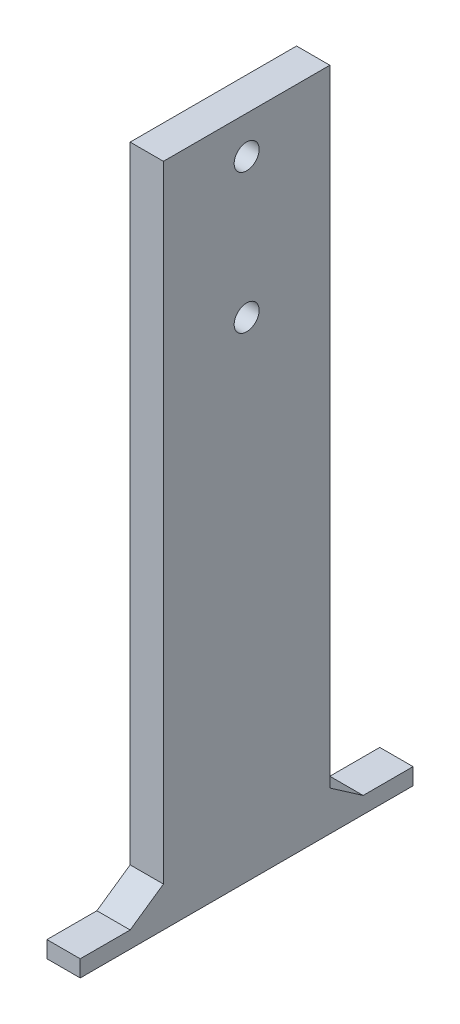
ISO-10303-21;
HEADER;
FILE_DESCRIPTION(('STEP AP214'),'2;1');
FILE_NAME('part.step','',(''),(''),'','','');
FILE_SCHEMA(('AUTOMOTIVE_DESIGN { 1 0 10303 214 1 1 1 1 }'));
ENDSEC;
DATA;
#1=APPLICATION_CONTEXT('core data for automotive mechanical design processes');
#2=APPLICATION_PROTOCOL_DEFINITION('international standard','automotive_design',2000,#1);
#3=PRODUCT_CONTEXT('',#1,'mechanical');
#4=PRODUCT('Part','Part','',(#3));
#5=PRODUCT_RELATED_PRODUCT_CATEGORY('part','',(#4));
#6=PRODUCT_DEFINITION_FORMATION('','',#4);
#7=PRODUCT_DEFINITION_CONTEXT('part definition',#1,'design');
#8=PRODUCT_DEFINITION('design','',#6,#7);
#9=PRODUCT_DEFINITION_SHAPE('','',#8);
#10=(LENGTH_UNIT() NAMED_UNIT(*) SI_UNIT(.MILLI.,.METRE.));
#11=(NAMED_UNIT(*) PLANE_ANGLE_UNIT() SI_UNIT($,.RADIAN.));
#12=(NAMED_UNIT(*) SI_UNIT($,.STERADIAN.) SOLID_ANGLE_UNIT());
#13=UNCERTAINTY_MEASURE_WITH_UNIT(LENGTH_MEASURE(1.E-05),#10,'distance_accuracy_value','');
#14=(GEOMETRIC_REPRESENTATION_CONTEXT(3) GLOBAL_UNCERTAINTY_ASSIGNED_CONTEXT((#13)) GLOBAL_UNIT_ASSIGNED_CONTEXT((#10,
#11,#12)) REPRESENTATION_CONTEXT('',''));
#15=CARTESIAN_POINT('',(0.,0.,0.));
#16=DIRECTION('',(0.,0.,1.));
#17=DIRECTION('',(1.,0.,0.));
#18=AXIS2_PLACEMENT_3D('',#15,#16,#17);
#19=CARTESIAN_POINT('',(0.,200.,25.));
#20=DIRECTION('',(0.,0.,-1.));
#21=DIRECTION('',(-1.,0.,0.));
#22=AXIS2_PLACEMENT_3D('',#19,#20,#21);
#23=PLANE('',#22);
#24=DIRECTION('',(0.,-1.,0.));
#25=VECTOR('',#24,1.);
#26=CARTESIAN_POINT('',(10.,200.,25.));
#27=LINE('',#26,#25);
#28=CARTESIAN_POINT('',(10.,5.,25.));
#29=VERTEX_POINT('',#28);
#30=CARTESIAN_POINT('',(10.,0.,25.));
#31=VERTEX_POINT('',#30);
#32=EDGE_CURVE('E51',#29,#31,#27,.T.);
#33=ORIENTED_EDGE('',*,*,#32,.F.);
#34=DIRECTION('',(-1.,0.,0.));
#35=VECTOR('',#34,1.);
#36=CARTESIAN_POINT('',(10.,5.,25.));
#37=LINE('',#36,#35);
#38=CARTESIAN_POINT('',(0.,5.,25.));
#39=VERTEX_POINT('',#38);
#40=EDGE_CURVE('E157',#29,#39,#37,.T.);
#41=ORIENTED_EDGE('',*,*,#40,.T.);
#42=DIRECTION('',(0.,-1.,0.));
#43=VECTOR('',#42,1.);
#44=CARTESIAN_POINT('',(0.,200.,25.));
#45=LINE('',#44,#43);
#46=CARTESIAN_POINT('',(0.,0.,25.));
#47=VERTEX_POINT('',#46);
#48=EDGE_CURVE('E11',#39,#47,#45,.T.);
#49=ORIENTED_EDGE('',*,*,#48,.T.);
#50=DIRECTION('',(1.,0.,0.));
#51=VECTOR('',#50,1.);
#52=CARTESIAN_POINT('',(0.,0.,25.));
#53=LINE('',#52,#51);
#54=EDGE_CURVE('E202',#47,#31,#53,.T.);
#55=ORIENTED_EDGE('',*,*,#54,.T.);
#56=EDGE_LOOP('',(#33,#41,#49,#55));
#57=FACE_BOUND('',#56,.T.);
#58=ADVANCED_FACE('F43',(#57),#23,.F.);
#59=CARTESIAN_POINT('',(10.,200.,-75.));
#60=DIRECTION('',(-1.,0.,0.));
#61=DIRECTION('',(0.,0.,1.));
#62=AXIS2_PLACEMENT_3D('',#59,#60,#61);
#63=PLANE('',#62);
#64=CARTESIAN_POINT('',(10.,146.899681817234,-25.));
#65=DIRECTION('',(1.,0.,0.));
#66=DIRECTION('',(0.,0.,-1.));
#67=AXIS2_PLACEMENT_3D('',#64,#65,#66);
#68=CIRCLE('',#67,3.75);
#69=CARTESIAN_POINT('',(10.,146.899681817234,-28.75));
#70=VERTEX_POINT('',#69);
#71=EDGE_CURVE('E203',#70,#70,#68,.T.);
#72=ORIENTED_EDGE('',*,*,#71,.F.);
#73=EDGE_LOOP('',(#72));
#74=FACE_BOUND('',#73,.T.);
#75=CARTESIAN_POINT('',(10.,188.775303778519,-25.));
#76=DIRECTION('',(1.,0.,0.));
#77=DIRECTION('',(0.,0.,-1.));
#78=AXIS2_PLACEMENT_3D('',#75,#76,#77);
#79=CIRCLE('',#78,3.75);
#80=CARTESIAN_POINT('',(10.,188.775303778519,-28.75));
#81=VERTEX_POINT('',#80);
#82=EDGE_CURVE('E207',#81,#81,#79,.T.);
#83=ORIENTED_EDGE('',*,*,#82,.F.);
#84=EDGE_LOOP('',(#83));
#85=FACE_BOUND('',#84,.T.);
#86=DIRECTION('',(0.,-0.570028639683379,0.821624823104023));
#87=VECTOR('',#86,1.);
#88=CARTESIAN_POINT('',(10.,5.,9.99999999999999));
#89=LINE('',#88,#87);
#90=CARTESIAN_POINT('',(10.,11.9378215415848,3.34454686168328E-12));
#91=VERTEX_POINT('',#90);
#92=CARTESIAN_POINT('',(10.,5.,9.99999999999999));
#93=VERTEX_POINT('',#92);
#94=EDGE_CURVE('E130',#91,#93,#89,.T.);
#95=ORIENTED_EDGE('',*,*,#94,.T.);
#96=DIRECTION('',(0.,0.,1.));
#97=VECTOR('',#96,1.);
#98=CARTESIAN_POINT('',(10.,5.,25.));
#99=LINE('',#98,#97);
#100=EDGE_CURVE('E136',#93,#29,#99,.T.);
#101=ORIENTED_EDGE('',*,*,#100,.T.);
#102=ORIENTED_EDGE('',*,*,#32,.T.);
#103=DIRECTION('',(0.,0.,-1.));
#104=VECTOR('',#103,1.);
#105=CARTESIAN_POINT('',(10.,0.,-75.));
#106=LINE('',#105,#104);
#107=CARTESIAN_POINT('',(10.,0.,-75.));
#108=VERTEX_POINT('',#107);
#109=EDGE_CURVE('E225',#31,#108,#106,.T.);
#110=ORIENTED_EDGE('',*,*,#109,.T.);
#111=DIRECTION('',(0.,-1.,0.));
#112=VECTOR('',#111,1.);
#113=CARTESIAN_POINT('',(10.,200.,-75.));
#114=LINE('',#113,#112);
#115=CARTESIAN_POINT('',(10.,5.,-75.));
#116=VERTEX_POINT('',#115);
#117=EDGE_CURVE('E238',#116,#108,#114,.T.);
#118=ORIENTED_EDGE('',*,*,#117,.F.);
#119=DIRECTION('',(0.,0.,1.));
#120=VECTOR('',#119,1.);
#121=CARTESIAN_POINT('',(10.,5.,-75.));
#122=LINE('',#121,#120);
#123=CARTESIAN_POINT('',(10.,5.,-60.));
#124=VERTEX_POINT('',#123);
#125=EDGE_CURVE('E182',#116,#124,#122,.T.);
#126=ORIENTED_EDGE('',*,*,#125,.T.);
#127=DIRECTION('',(0.,0.570028639683379,0.821624823104023));
#128=VECTOR('',#127,1.);
#129=CARTESIAN_POINT('',(10.,5.,-60.));
#130=LINE('',#129,#128);
#131=CARTESIAN_POINT('',(10.,11.9378215415848,-50.0000000000034));
#132=VERTEX_POINT('',#131);
#133=EDGE_CURVE('E191',#124,#132,#130,.T.);
#134=ORIENTED_EDGE('',*,*,#133,.T.);
#135=DIRECTION('',(0.,1.,0.));
#136=VECTOR('',#135,1.);
#137=CARTESIAN_POINT('',(10.,11.9378215415848,-50.0000000000034));
#138=LINE('',#137,#136);
#139=CARTESIAN_POINT('',(10.,200.,-50.0000000000034));
#140=VERTEX_POINT('',#139);
#141=EDGE_CURVE('E169',#132,#140,#138,.T.);
#142=ORIENTED_EDGE('',*,*,#141,.T.);
#143=DIRECTION('',(0.,0.,-1.));
#144=VECTOR('',#143,1.);
#145=CARTESIAN_POINT('',(10.,200.,25.));
#146=LINE('',#145,#144);
#147=CARTESIAN_POINT('',(10.,200.,3.34454686168328E-12));
#148=VERTEX_POINT('',#147);
#149=EDGE_CURVE('E142',#148,#140,#146,.T.);
#150=ORIENTED_EDGE('',*,*,#149,.F.);
#151=DIRECTION('',(0.,-1.,0.));
#152=VECTOR('',#151,1.);
#153=CARTESIAN_POINT('',(10.,11.9378215415848,3.34454686168328E-12));
#154=LINE('',#153,#152);
#155=EDGE_CURVE('E58',#148,#91,#154,.T.);
#156=ORIENTED_EDGE('',*,*,#155,.T.);
#157=EDGE_LOOP('',(#95,#101,#102,#110,#118,#126,#134,#142,#150,#156));
#158=FACE_BOUND('',#157,.T.);
#159=ADVANCED_FACE('F139',(#74,#85,#158),#63,.F.);
#160=CARTESIAN_POINT('',(0.,200.,-75.));
#161=DIRECTION('',(0.,0.,1.));
#162=DIRECTION('',(1.,0.,0.));
#163=AXIS2_PLACEMENT_3D('',#160,#161,#162);
#164=PLANE('',#163);
#165=DIRECTION('',(0.,-1.,0.));
#166=VECTOR('',#165,1.);
#167=CARTESIAN_POINT('',(0.,200.,-75.));
#168=LINE('',#167,#166);
#169=CARTESIAN_POINT('',(0.,5.,-75.));
#170=VERTEX_POINT('',#169);
#171=CARTESIAN_POINT('',(0.,0.,-75.));
#172=VERTEX_POINT('',#171);
#173=EDGE_CURVE('E221',#170,#172,#168,.T.);
#174=ORIENTED_EDGE('',*,*,#173,.F.);
#175=DIRECTION('',(-1.,0.,0.));
#176=VECTOR('',#175,1.);
#177=CARTESIAN_POINT('',(10.,5.,-75.));
#178=LINE('',#177,#176);
#179=EDGE_CURVE('E166',#116,#170,#178,.T.);
#180=ORIENTED_EDGE('',*,*,#179,.F.);
#181=ORIENTED_EDGE('',*,*,#117,.T.);
#182=DIRECTION('',(-1.,0.,0.));
#183=VECTOR('',#182,1.);
#184=CARTESIAN_POINT('',(0.,0.,-75.));
#185=LINE('',#184,#183);
#186=EDGE_CURVE('E229',#108,#172,#185,.T.);
#187=ORIENTED_EDGE('',*,*,#186,.T.);
#188=EDGE_LOOP('',(#174,#180,#181,#187));
#189=FACE_BOUND('',#188,.T.);
#190=ADVANCED_FACE('F257',(#189),#164,.F.);
#191=CARTESIAN_POINT('',(0.,200.,0.));
#192=DIRECTION('',(1.,0.,0.));
#193=DIRECTION('',(0.,0.,-1.));
#194=AXIS2_PLACEMENT_3D('',#191,#192,#193);
#195=PLANE('',#194);
#196=CARTESIAN_POINT('',(0.,146.899681817234,-25.));
#197=DIRECTION('',(1.,0.,0.));
#198=DIRECTION('',(0.,0.,-1.));
#199=AXIS2_PLACEMENT_3D('',#196,#197,#198);
#200=CIRCLE('',#199,3.75);
#201=CARTESIAN_POINT('',(0.,146.899681817234,-28.75));
#202=VERTEX_POINT('',#201);
#203=EDGE_CURVE('E198',#202,#202,#200,.T.);
#204=ORIENTED_EDGE('',*,*,#203,.T.);
#205=EDGE_LOOP('',(#204));
#206=FACE_BOUND('',#205,.T.);
#207=CARTESIAN_POINT('',(0.,188.775303778519,-25.));
#208=DIRECTION('',(1.,0.,0.));
#209=DIRECTION('',(0.,0.,-1.));
#210=AXIS2_PLACEMENT_3D('',#207,#208,#209);
#211=CIRCLE('',#210,3.75);
#212=CARTESIAN_POINT('',(0.,188.775303778519,-28.75));
#213=VERTEX_POINT('',#212);
#214=EDGE_CURVE('E161',#213,#213,#211,.T.);
#215=ORIENTED_EDGE('',*,*,#214,.T.);
#216=EDGE_LOOP('',(#215));
#217=FACE_BOUND('',#216,.T.);
#218=ORIENTED_EDGE('',*,*,#48,.F.);
#219=DIRECTION('',(0.,0.,1.));
#220=VECTOR('',#219,1.);
#221=CARTESIAN_POINT('',(0.,5.,25.));
#222=LINE('',#221,#220);
#223=CARTESIAN_POINT('',(0.,5.,9.99999999999999));
#224=VERTEX_POINT('',#223);
#225=EDGE_CURVE('E144',#224,#39,#222,.T.);
#226=ORIENTED_EDGE('',*,*,#225,.F.);
#227=DIRECTION('',(0.,-0.570028639683379,0.821624823104023));
#228=VECTOR('',#227,1.);
#229=CARTESIAN_POINT('',(0.,5.,9.99999999999999));
#230=LINE('',#229,#228);
#231=CARTESIAN_POINT('',(0.,11.9378215415848,3.34454686168328E-12));
#232=VERTEX_POINT('',#231);
#233=EDGE_CURVE('E147',#232,#224,#230,.T.);
#234=ORIENTED_EDGE('',*,*,#233,.F.);
#235=DIRECTION('',(0.,-1.,0.));
#236=VECTOR('',#235,1.);
#237=CARTESIAN_POINT('',(0.,11.9378215415848,3.34454686168328E-12));
#238=LINE('',#237,#236);
#239=CARTESIAN_POINT('',(0.,200.,3.34454686168328E-12));
#240=VERTEX_POINT('',#239);
#241=EDGE_CURVE('E121',#240,#232,#238,.T.);
#242=ORIENTED_EDGE('',*,*,#241,.F.);
#243=DIRECTION('',(0.,0.,1.));
#244=VECTOR('',#243,1.);
#245=CARTESIAN_POINT('',(0.,200.,0.));
#246=LINE('',#245,#244);
#247=CARTESIAN_POINT('',(0.,200.,-50.0000000000034));
#248=VERTEX_POINT('',#247);
#249=EDGE_CURVE('E214',#248,#240,#246,.T.);
#250=ORIENTED_EDGE('',*,*,#249,.F.);
#251=DIRECTION('',(0.,1.,0.));
#252=VECTOR('',#251,1.);
#253=CARTESIAN_POINT('',(0.,11.9378215415848,-50.0000000000034));
#254=LINE('',#253,#252);
#255=CARTESIAN_POINT('',(0.,11.9378215415848,-50.0000000000034));
#256=VERTEX_POINT('',#255);
#257=EDGE_CURVE('E66',#256,#248,#254,.T.);
#258=ORIENTED_EDGE('',*,*,#257,.F.);
#259=DIRECTION('',(0.,0.570028639683379,0.821624823104023));
#260=VECTOR('',#259,1.);
#261=CARTESIAN_POINT('',(0.,5.,-60.));
#262=LINE('',#261,#260);
#263=CARTESIAN_POINT('',(0.,5.,-60.));
#264=VERTEX_POINT('',#263);
#265=EDGE_CURVE('E181',#264,#256,#262,.T.);
#266=ORIENTED_EDGE('',*,*,#265,.F.);
#267=DIRECTION('',(0.,0.,1.));
#268=VECTOR('',#267,1.);
#269=CARTESIAN_POINT('',(0.,5.,-75.));
#270=LINE('',#269,#268);
#271=EDGE_CURVE('E154',#170,#264,#270,.T.);
#272=ORIENTED_EDGE('',*,*,#271,.F.);
#273=ORIENTED_EDGE('',*,*,#173,.T.);
#274=DIRECTION('',(0.,0.,1.));
#275=VECTOR('',#274,1.);
#276=CARTESIAN_POINT('',(0.,0.,0.));
#277=LINE('',#276,#275);
#278=EDGE_CURVE('E218',#172,#47,#277,.T.);
#279=ORIENTED_EDGE('',*,*,#278,.T.);
#280=EDGE_LOOP('',(#218,#226,#234,#242,#250,#258,#266,#272,#273,#279));
#281=FACE_BOUND('',#280,.T.);
#282=ADVANCED_FACE('F253',(#206,#217,#281),#195,.F.);
#283=CARTESIAN_POINT('',(0.,200.,0.));
#284=DIRECTION('',(0.,1.,0.));
#285=DIRECTION('',(0.,0.,1.));
#286=AXIS2_PLACEMENT_3D('',#283,#284,#285);
#287=PLANE('',#286);
#288=DIRECTION('',(-1.,0.,0.));
#289=VECTOR('',#288,1.);
#290=CARTESIAN_POINT('',(10.,200.,3.34454686168328E-12));
#291=LINE('',#290,#289);
#292=EDGE_CURVE('E127',#148,#240,#291,.T.);
#293=ORIENTED_EDGE('',*,*,#292,.F.);
#294=ORIENTED_EDGE('',*,*,#149,.T.);
#295=DIRECTION('',(-1.,0.,0.));
#296=VECTOR('',#295,1.);
#297=CARTESIAN_POINT('',(10.,200.,-50.0000000000034));
#298=LINE('',#297,#296);
#299=EDGE_CURVE('E176',#140,#248,#298,.T.);
#300=ORIENTED_EDGE('',*,*,#299,.T.);
#301=ORIENTED_EDGE('',*,*,#249,.T.);
#302=EDGE_LOOP('',(#293,#294,#300,#301));
#303=FACE_BOUND('',#302,.T.);
#304=ADVANCED_FACE('F268',(#303),#287,.T.);
#305=CARTESIAN_POINT('',(0.,0.,0.));
#306=DIRECTION('',(0.,1.,0.));
#307=DIRECTION('',(0.,0.,1.));
#308=AXIS2_PLACEMENT_3D('',#305,#306,#307);
#309=PLANE('',#308);
#310=ORIENTED_EDGE('',*,*,#54,.F.);
#311=ORIENTED_EDGE('',*,*,#278,.F.);
#312=ORIENTED_EDGE('',*,*,#186,.F.);
#313=ORIENTED_EDGE('',*,*,#109,.F.);
#314=EDGE_LOOP('',(#310,#311,#312,#313));
#315=FACE_BOUND('',#314,.T.);
#316=ADVANCED_FACE('F248',(#315),#309,.F.);
#317=CARTESIAN_POINT('',(0.,188.775303778519,-25.));
#318=DIRECTION('',(1.,0.,0.));
#319=DIRECTION('',(0.,0.,-1.));
#320=AXIS2_PLACEMENT_3D('',#317,#318,#319);
#321=CYLINDRICAL_SURFACE('',#320,3.75);
#322=ORIENTED_EDGE('',*,*,#214,.F.);
#323=EDGE_LOOP('',(#322));
#324=FACE_BOUND('',#323,.T.);
#325=ORIENTED_EDGE('',*,*,#82,.T.);
#326=EDGE_LOOP('',(#325));
#327=FACE_BOUND('',#326,.T.);
#328=ADVANCED_FACE('F297',(#324,#327),#321,.F.);
#329=CARTESIAN_POINT('',(0.,146.899681817234,-25.));
#330=DIRECTION('',(1.,0.,0.));
#331=DIRECTION('',(0.,0.,-1.));
#332=AXIS2_PLACEMENT_3D('',#329,#330,#331);
#333=CYLINDRICAL_SURFACE('',#332,3.75);
#334=ORIENTED_EDGE('',*,*,#203,.F.);
#335=EDGE_LOOP('',(#334));
#336=FACE_BOUND('',#335,.T.);
#337=ORIENTED_EDGE('',*,*,#71,.T.);
#338=EDGE_LOOP('',(#337));
#339=FACE_BOUND('',#338,.T.);
#340=ADVANCED_FACE('F302',(#336,#339),#333,.F.);
#341=CARTESIAN_POINT('',(10.,11.9378215415848,-50.0000000000034));
#342=DIRECTION('',(0.,0.,1.));
#343=DIRECTION('',(1.,0.,0.));
#344=AXIS2_PLACEMENT_3D('',#341,#342,#343);
#345=PLANE('',#344);
#346=ORIENTED_EDGE('',*,*,#257,.T.);
#347=ORIENTED_EDGE('',*,*,#299,.F.);
#348=ORIENTED_EDGE('',*,*,#141,.F.);
#349=DIRECTION('',(-1.,0.,0.));
#350=VECTOR('',#349,1.);
#351=CARTESIAN_POINT('',(10.,11.9378215415848,-50.0000000000034));
#352=LINE('',#351,#350);
#353=EDGE_CURVE('E173',#132,#256,#352,.T.);
#354=ORIENTED_EDGE('',*,*,#353,.T.);
#355=EDGE_LOOP('',(#346,#347,#348,#354));
#356=FACE_BOUND('',#355,.T.);
#357=ADVANCED_FACE('F266',(#356),#345,.F.);
#358=CARTESIAN_POINT('',(10.,5.,-60.));
#359=DIRECTION('',(0.,-0.821624823104023,0.570028639683379));
#360=DIRECTION('',(0.,-0.570028639683379,-0.821624823104023));
#361=AXIS2_PLACEMENT_3D('',#358,#359,#360);
#362=PLANE('',#361);
#363=ORIENTED_EDGE('',*,*,#265,.T.);
#364=ORIENTED_EDGE('',*,*,#353,.F.);
#365=ORIENTED_EDGE('',*,*,#133,.F.);
#366=DIRECTION('',(-1.,0.,0.));
#367=VECTOR('',#366,1.);
#368=CARTESIAN_POINT('',(10.,5.,-60.));
#369=LINE('',#368,#367);
#370=EDGE_CURVE('E170',#124,#264,#369,.T.);
#371=ORIENTED_EDGE('',*,*,#370,.T.);
#372=EDGE_LOOP('',(#363,#364,#365,#371));
#373=FACE_BOUND('',#372,.T.);
#374=ADVANCED_FACE('F264',(#373),#362,.F.);
#375=CARTESIAN_POINT('',(10.,5.,-75.));
#376=DIRECTION('',(0.,-1.,0.));
#377=DIRECTION('',(0.,0.,-1.));
#378=AXIS2_PLACEMENT_3D('',#375,#376,#377);
#379=PLANE('',#378);
#380=ORIENTED_EDGE('',*,*,#271,.T.);
#381=ORIENTED_EDGE('',*,*,#370,.F.);
#382=ORIENTED_EDGE('',*,*,#125,.F.);
#383=ORIENTED_EDGE('',*,*,#179,.T.);
#384=EDGE_LOOP('',(#380,#381,#382,#383));
#385=FACE_BOUND('',#384,.T.);
#386=ADVANCED_FACE('F261',(#385),#379,.F.);
#387=CARTESIAN_POINT('',(10.,5.,25.));
#388=DIRECTION('',(0.,-1.,0.));
#389=DIRECTION('',(0.,0.,-1.));
#390=AXIS2_PLACEMENT_3D('',#387,#388,#389);
#391=PLANE('',#390);
#392=ORIENTED_EDGE('',*,*,#225,.T.);
#393=ORIENTED_EDGE('',*,*,#40,.F.);
#394=ORIENTED_EDGE('',*,*,#100,.F.);
#395=DIRECTION('',(-1.,0.,0.));
#396=VECTOR('',#395,1.);
#397=CARTESIAN_POINT('',(10.,5.,9.99999999999999));
#398=LINE('',#397,#396);
#399=EDGE_CURVE('E126',#93,#224,#398,.T.);
#400=ORIENTED_EDGE('',*,*,#399,.T.);
#401=EDGE_LOOP('',(#392,#393,#394,#400));
#402=FACE_BOUND('',#401,.T.);
#403=ADVANCED_FACE('F271',(#402),#391,.F.);
#404=CARTESIAN_POINT('',(10.,5.,9.99999999999999));
#405=DIRECTION('',(0.,-0.821624823104023,-0.570028639683379));
#406=DIRECTION('',(0.,0.570028639683379,-0.821624823104023));
#407=AXIS2_PLACEMENT_3D('',#404,#405,#406);
#408=PLANE('',#407);
#409=ORIENTED_EDGE('',*,*,#233,.T.);
#410=ORIENTED_EDGE('',*,*,#399,.F.);
#411=ORIENTED_EDGE('',*,*,#94,.F.);
#412=DIRECTION('',(-1.,0.,0.));
#413=VECTOR('',#412,1.);
#414=CARTESIAN_POINT('',(10.,11.9378215415848,3.34454686168328E-12));
#415=LINE('',#414,#413);
#416=EDGE_CURVE('E117',#91,#232,#415,.T.);
#417=ORIENTED_EDGE('',*,*,#416,.T.);
#418=EDGE_LOOP('',(#409,#410,#411,#417));
#419=FACE_BOUND('',#418,.T.);
#420=ADVANCED_FACE('F131',(#419),#408,.F.);
#421=CARTESIAN_POINT('',(10.,11.9378215415848,3.34454686168328E-12));
#422=DIRECTION('',(0.,0.,-1.));
#423=DIRECTION('',(-1.,0.,0.));
#424=AXIS2_PLACEMENT_3D('',#421,#422,#423);
#425=PLANE('',#424);
#426=ORIENTED_EDGE('',*,*,#241,.T.);
#427=ORIENTED_EDGE('',*,*,#416,.F.);
#428=ORIENTED_EDGE('',*,*,#155,.F.);
#429=ORIENTED_EDGE('',*,*,#292,.T.);
#430=EDGE_LOOP('',(#426,#427,#428,#429));
#431=FACE_BOUND('',#430,.T.);
#432=ADVANCED_FACE('F119',(#431),#425,.F.);
#433=CLOSED_SHELL('',(#58,#159,#190,#282,#304,#316,#328,#340,#357,#374,#386,#403,#420,#432));
#434=MANIFOLD_SOLID_BREP('B2',#433);
#435=ADVANCED_BREP_SHAPE_REPRESENTATION('',(#18,#434),#14);
#436=SHAPE_DEFINITION_REPRESENTATION(#9,#435);
ENDSEC;
END-ISO-10303-21;
